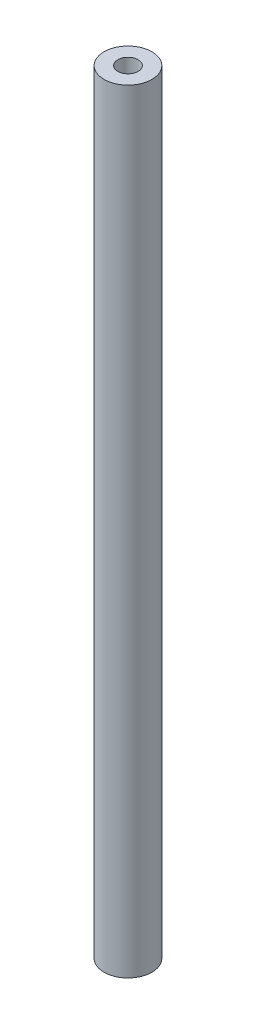
ISO-10303-21;
HEADER;
FILE_DESCRIPTION(('STEP AP214'),'2;1');
FILE_NAME('part.step','',(''),(''),'','','');
FILE_SCHEMA(('AUTOMOTIVE_DESIGN { 1 0 10303 214 1 1 1 1 }'));
ENDSEC;
DATA;
#1=APPLICATION_CONTEXT('core data for automotive mechanical design processes');
#2=APPLICATION_PROTOCOL_DEFINITION('international standard','automotive_design',2000,#1);
#3=PRODUCT_CONTEXT('',#1,'mechanical');
#4=PRODUCT('Part','Part','',(#3));
#5=PRODUCT_RELATED_PRODUCT_CATEGORY('part','',(#4));
#6=PRODUCT_DEFINITION_FORMATION('','',#4);
#7=PRODUCT_DEFINITION_CONTEXT('part definition',#1,'design');
#8=PRODUCT_DEFINITION('design','',#6,#7);
#9=PRODUCT_DEFINITION_SHAPE('','',#8);
#10=(LENGTH_UNIT() NAMED_UNIT(*) SI_UNIT(.MILLI.,.METRE.));
#11=(NAMED_UNIT(*) PLANE_ANGLE_UNIT() SI_UNIT($,.RADIAN.));
#12=(NAMED_UNIT(*) SI_UNIT($,.STERADIAN.) SOLID_ANGLE_UNIT());
#13=UNCERTAINTY_MEASURE_WITH_UNIT(LENGTH_MEASURE(1.E-05),#10,'distance_accuracy_value','');
#14=(GEOMETRIC_REPRESENTATION_CONTEXT(3) GLOBAL_UNCERTAINTY_ASSIGNED_CONTEXT((#13)) GLOBAL_UNIT_ASSIGNED_CONTEXT((#10,
#11,#12)) REPRESENTATION_CONTEXT('',''));
#15=CARTESIAN_POINT('',(0.,0.,0.));
#16=DIRECTION('',(0.,0.,1.));
#17=DIRECTION('',(1.,0.,0.));
#18=AXIS2_PLACEMENT_3D('',#15,#16,#17);
#19=CARTESIAN_POINT('',(0.,153.7335,0.));
#20=DIRECTION('',(0.,-1.,0.));
#21=DIRECTION('',(0.,0.,-1.));
#22=AXIS2_PLACEMENT_3D('',#19,#20,#21);
#23=CYLINDRICAL_SURFACE('',#22,4.7625);
#24=CARTESIAN_POINT('',(0.,153.7335,0.));
#25=DIRECTION('',(0.,1.,0.));
#26=DIRECTION('',(0.,0.,1.));
#27=AXIS2_PLACEMENT_3D('',#24,#25,#26);
#28=CIRCLE('',#27,4.7625);
#29=CARTESIAN_POINT('',(0.,153.7335,4.7625));
#30=VERTEX_POINT('',#29);
#31=EDGE_CURVE('E11',#30,#30,#28,.T.);
#32=ORIENTED_EDGE('',*,*,#31,.F.);
#33=EDGE_LOOP('',(#32));
#34=FACE_BOUND('',#33,.T.);
#35=CARTESIAN_POINT('',(0.,0.,0.));
#36=DIRECTION('',(0.,1.,0.));
#37=DIRECTION('',(0.,0.,1.));
#38=AXIS2_PLACEMENT_3D('',#35,#36,#37);
#39=CIRCLE('',#38,4.7625);
#40=CARTESIAN_POINT('',(0.,0.,4.7625));
#41=VERTEX_POINT('',#40);
#42=EDGE_CURVE('E44',#41,#41,#39,.T.);
#43=ORIENTED_EDGE('',*,*,#42,.T.);
#44=EDGE_LOOP('',(#43));
#45=FACE_BOUND('',#44,.T.);
#46=ADVANCED_FACE('F41',(#34,#45),#23,.T.);
#47=CARTESIAN_POINT('',(0.,153.7335,0.));
#48=DIRECTION('',(0.,1.,0.));
#49=DIRECTION('',(0.,0.,1.));
#50=AXIS2_PLACEMENT_3D('',#47,#48,#49);
#51=PLANE('',#50);
#52=CARTESIAN_POINT('',(0.,153.7335,0.));
#53=DIRECTION('',(0.,1.,0.));
#54=DIRECTION('',(0.,0.,1.));
#55=AXIS2_PLACEMENT_3D('',#52,#53,#54);
#56=CIRCLE('',#55,2.01929999999999);
#57=CARTESIAN_POINT('',(0.,153.7335,2.01929999999999));
#58=VERTEX_POINT('',#57);
#59=EDGE_CURVE('E65',#58,#58,#56,.T.);
#60=ORIENTED_EDGE('',*,*,#59,.F.);
#61=EDGE_LOOP('',(#60));
#62=FACE_BOUND('',#61,.T.);
#63=ORIENTED_EDGE('',*,*,#31,.T.);
#64=EDGE_LOOP('',(#63));
#65=FACE_BOUND('',#64,.T.);
#66=ADVANCED_FACE('F83',(#62,#65),#51,.T.);
#67=CARTESIAN_POINT('',(0.,0.,0.));
#68=DIRECTION('',(0.,1.,0.));
#69=DIRECTION('',(0.,0.,1.));
#70=AXIS2_PLACEMENT_3D('',#67,#68,#69);
#71=PLANE('',#70);
#72=CARTESIAN_POINT('',(0.,0.,0.));
#73=DIRECTION('',(0.,-1.,0.));
#74=DIRECTION('',(0.,0.,-1.));
#75=AXIS2_PLACEMENT_3D('',#72,#73,#74);
#76=CIRCLE('',#75,2.01929999999999);
#77=CARTESIAN_POINT('',(0.,0.,-2.01929999999999));
#78=VERTEX_POINT('',#77);
#79=EDGE_CURVE('E64',#78,#78,#76,.T.);
#80=ORIENTED_EDGE('',*,*,#79,.F.);
#81=EDGE_LOOP('',(#80));
#82=FACE_BOUND('',#81,.T.);
#83=ORIENTED_EDGE('',*,*,#42,.F.);
#84=EDGE_LOOP('',(#83));
#85=FACE_BOUND('',#84,.T.);
#86=ADVANCED_FACE('F80',(#82,#85),#71,.F.);
#87=CARTESIAN_POINT('',(0.,10.16,0.));
#88=DIRECTION('',(0.,-1.,0.));
#89=DIRECTION('',(0.,0.,-1.));
#90=AXIS2_PLACEMENT_3D('',#87,#88,#89);
#91=CONICAL_SURFACE('',#90,2.0193,1.02974425867665);
#92=CARTESIAN_POINT('',(0.,11.3733178480024,0.));
#93=VERTEX_POINT('',#92);
#94=VERTEX_LOOP('',#93);
#95=FACE_BOUND('',#94,.T.);
#96=CARTESIAN_POINT('',(0.,10.16,0.));
#97=DIRECTION('',(0.,-1.,0.));
#98=DIRECTION('',(0.,0.,-1.));
#99=AXIS2_PLACEMENT_3D('',#96,#97,#98);
#100=CIRCLE('',#99,2.0193);
#101=CARTESIAN_POINT('',(0.,10.16,-2.0193));
#102=VERTEX_POINT('',#101);
#103=EDGE_CURVE('E68',#102,#102,#100,.T.);
#104=ORIENTED_EDGE('',*,*,#103,.T.);
#105=EDGE_LOOP('',(#104));
#106=FACE_BOUND('',#105,.T.);
#107=ADVANCED_FACE('F82',(#95,#106),#91,.F.);
#108=CARTESIAN_POINT('',(0.,0.,0.));
#109=DIRECTION('',(0.,-1.,0.));
#110=DIRECTION('',(0.,0.,-1.));
#111=AXIS2_PLACEMENT_3D('',#108,#109,#110);
#112=CYLINDRICAL_SURFACE('',#111,2.01929999999999);
#113=ORIENTED_EDGE('',*,*,#103,.F.);
#114=EDGE_LOOP('',(#113));
#115=FACE_BOUND('',#114,.T.);
#116=ORIENTED_EDGE('',*,*,#79,.T.);
#117=EDGE_LOOP('',(#116));
#118=FACE_BOUND('',#117,.T.);
#119=ADVANCED_FACE('F58',(#115,#118),#112,.F.);
#120=CARTESIAN_POINT('',(0.,141.7955,0.));
#121=DIRECTION('',(0.,1.,0.));
#122=DIRECTION('',(0.,0.,1.));
#123=AXIS2_PLACEMENT_3D('',#120,#121,#122);
#124=CONICAL_SURFACE('',#123,2.0193,1.02974425867665);
#125=CARTESIAN_POINT('',(0.,140.582182151998,0.));
#126=VERTEX_POINT('',#125);
#127=VERTEX_LOOP('',#126);
#128=FACE_BOUND('',#127,.T.);
#129=CARTESIAN_POINT('',(0.,141.7955,0.));
#130=DIRECTION('',(0.,1.,0.));
#131=DIRECTION('',(0.,0.,1.));
#132=AXIS2_PLACEMENT_3D('',#129,#130,#131);
#133=CIRCLE('',#132,2.0193);
#134=CARTESIAN_POINT('',(0.,141.7955,2.0193));
#135=VERTEX_POINT('',#134);
#136=EDGE_CURVE('E62',#135,#135,#133,.T.);
#137=ORIENTED_EDGE('',*,*,#136,.T.);
#138=EDGE_LOOP('',(#137));
#139=FACE_BOUND('',#138,.T.);
#140=ADVANCED_FACE('F54',(#128,#139),#124,.F.);
#141=CARTESIAN_POINT('',(0.,153.7335,0.));
#142=DIRECTION('',(0.,1.,0.));
#143=DIRECTION('',(0.,0.,1.));
#144=AXIS2_PLACEMENT_3D('',#141,#142,#143);
#145=CYLINDRICAL_SURFACE('',#144,2.01929999999999);
#146=ORIENTED_EDGE('',*,*,#136,.F.);
#147=EDGE_LOOP('',(#146));
#148=FACE_BOUND('',#147,.T.);
#149=ORIENTED_EDGE('',*,*,#59,.T.);
#150=EDGE_LOOP('',(#149));
#151=FACE_BOUND('',#150,.T.);
#152=ADVANCED_FACE('F57',(#148,#151),#145,.F.);
#153=CLOSED_SHELL('',(#46,#66,#86,#107,#119,#140,#152));
#154=MANIFOLD_SOLID_BREP('B2',#153);
#155=ADVANCED_BREP_SHAPE_REPRESENTATION('',(#18,#154),#14);
#156=SHAPE_DEFINITION_REPRESENTATION(#9,#155);
ENDSEC;
END-ISO-10303-21;
